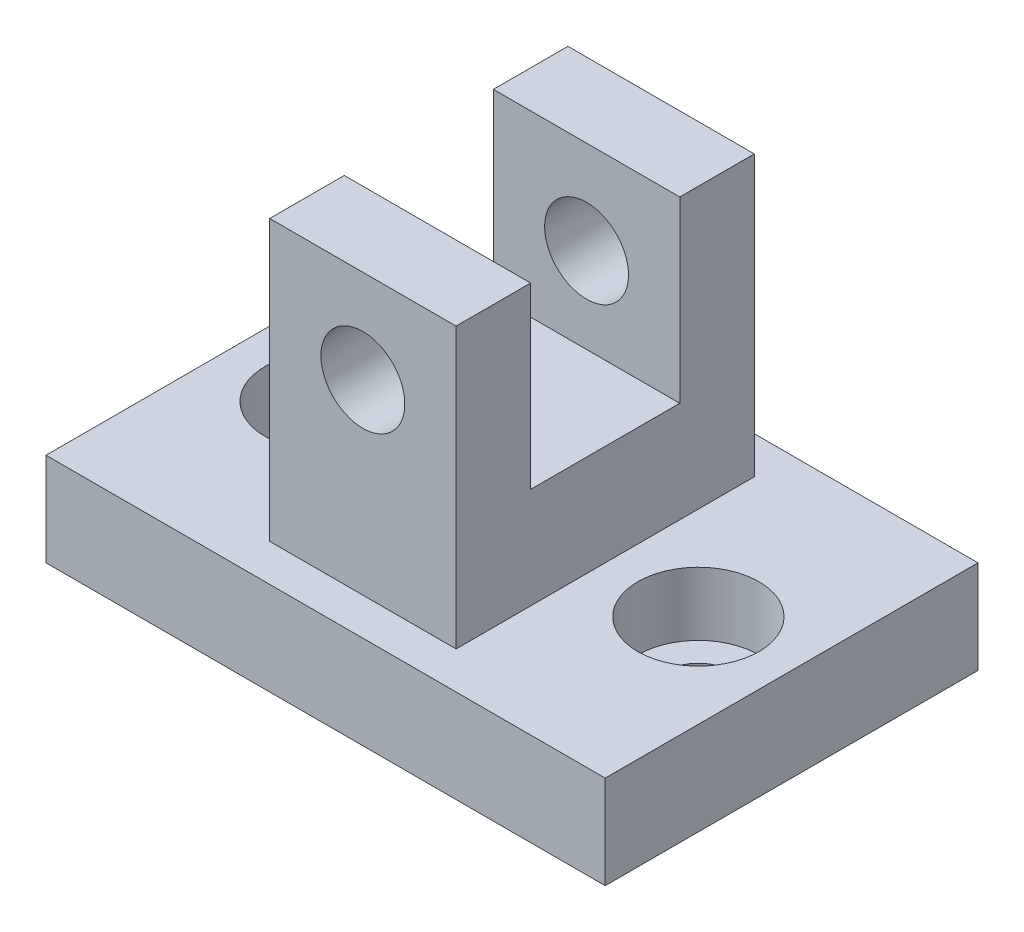
ISO-10303-21;
HEADER;
FILE_DESCRIPTION(('STEP AP214'),'2;1');
FILE_NAME('part.step','',(''),(''),'','','');
FILE_SCHEMA(('AUTOMOTIVE_DESIGN { 1 0 10303 214 1 1 1 1 }'));
ENDSEC;
DATA;
#1=APPLICATION_CONTEXT('core data for automotive mechanical design processes');
#2=APPLICATION_PROTOCOL_DEFINITION('international standard','automotive_design',2000,#1);
#3=PRODUCT_CONTEXT('',#1,'mechanical');
#4=PRODUCT('Part','Part','',(#3));
#5=PRODUCT_RELATED_PRODUCT_CATEGORY('part','',(#4));
#6=PRODUCT_DEFINITION_FORMATION('','',#4);
#7=PRODUCT_DEFINITION_CONTEXT('part definition',#1,'design');
#8=PRODUCT_DEFINITION('design','',#6,#7);
#9=PRODUCT_DEFINITION_SHAPE('','',#8);
#10=(LENGTH_UNIT() NAMED_UNIT(*) SI_UNIT(.MILLI.,.METRE.));
#11=(NAMED_UNIT(*) PLANE_ANGLE_UNIT() SI_UNIT($,.RADIAN.));
#12=(NAMED_UNIT(*) SI_UNIT($,.STERADIAN.) SOLID_ANGLE_UNIT());
#13=UNCERTAINTY_MEASURE_WITH_UNIT(LENGTH_MEASURE(1.E-05),#10,'distance_accuracy_value','');
#14=(GEOMETRIC_REPRESENTATION_CONTEXT(3) GLOBAL_UNCERTAINTY_ASSIGNED_CONTEXT((#13)) GLOBAL_UNIT_ASSIGNED_CONTEXT((#10,
#11,#12)) REPRESENTATION_CONTEXT('',''));
#15=CARTESIAN_POINT('',(0.,0.,0.));
#16=DIRECTION('',(0.,0.,1.));
#17=DIRECTION('',(1.,0.,0.));
#18=AXIS2_PLACEMENT_3D('',#15,#16,#17);
#19=CARTESIAN_POINT('',(0.,20.,0.));
#20=DIRECTION('',(0.,-1.,0.));
#21=DIRECTION('',(0.,0.,-1.));
#22=AXIS2_PLACEMENT_3D('',#19,#20,#21);
#23=PLANE('',#22);
#24=DIRECTION('',(0.,0.,1.));
#25=VECTOR('',#24,1.);
#26=CARTESIAN_POINT('',(-5.,20.,8.));
#27=LINE('',#26,#25);
#28=CARTESIAN_POINT('',(-5.,20.,-8.));
#29=VERTEX_POINT('',#28);
#30=CARTESIAN_POINT('',(-5.,20.,-4.));
#31=VERTEX_POINT('',#30);
#32=EDGE_CURVE('E164',#29,#31,#27,.T.);
#33=ORIENTED_EDGE('',*,*,#32,.T.);
#34=DIRECTION('',(1.,0.,0.));
#35=VECTOR('',#34,1.);
#36=CARTESIAN_POINT('',(0.,20.,-4.));
#37=LINE('',#36,#35);
#38=CARTESIAN_POINT('',(5.,20.,-4.));
#39=VERTEX_POINT('',#38);
#40=EDGE_CURVE('E11',#31,#39,#37,.T.);
#41=ORIENTED_EDGE('',*,*,#40,.T.);
#42=DIRECTION('',(0.,0.,-1.));
#43=VECTOR('',#42,1.);
#44=CARTESIAN_POINT('',(5.,20.,8.));
#45=LINE('',#44,#43);
#46=CARTESIAN_POINT('',(5.,20.,-8.));
#47=VERTEX_POINT('',#46);
#48=EDGE_CURVE('E161',#39,#47,#45,.T.);
#49=ORIENTED_EDGE('',*,*,#48,.T.);
#50=DIRECTION('',(-1.,0.,0.));
#51=VECTOR('',#50,1.);
#52=CARTESIAN_POINT('',(-5.,20.,-8.));
#53=LINE('',#52,#51);
#54=EDGE_CURVE('E160',#47,#29,#53,.T.);
#55=ORIENTED_EDGE('',*,*,#54,.T.);
#56=EDGE_LOOP('',(#33,#41,#49,#55));
#57=FACE_BOUND('',#56,.T.);
#58=ADVANCED_FACE('F33',(#57),#23,.F.);
#59=CARTESIAN_POINT('',(0.,5.,0.));
#60=DIRECTION('',(0.,-1.,0.));
#61=DIRECTION('',(0.,0.,-1.));
#62=AXIS2_PLACEMENT_3D('',#59,#60,#61);
#63=PLANE('',#62);
#64=CARTESIAN_POINT('',(-10.,5.,0.));
#65=DIRECTION('',(0.,1.,0.));
#66=DIRECTION('',(0.,0.,1.));
#67=AXIS2_PLACEMENT_3D('',#64,#65,#66);
#68=CIRCLE('',#67,3.25);
#69=CARTESIAN_POINT('',(-10.,5.,3.25));
#70=VERTEX_POINT('',#69);
#71=EDGE_CURVE('E419',#70,#70,#68,.T.);
#72=ORIENTED_EDGE('',*,*,#71,.F.);
#73=EDGE_LOOP('',(#72));
#74=FACE_BOUND('',#73,.T.);
#75=CARTESIAN_POINT('',(10.,5.,0.));
#76=DIRECTION('',(0.,1.,0.));
#77=DIRECTION('',(0.,0.,1.));
#78=AXIS2_PLACEMENT_3D('',#75,#76,#77);
#79=CIRCLE('',#78,3.25);
#80=CARTESIAN_POINT('',(10.,5.,3.25));
#81=VERTEX_POINT('',#80);
#82=EDGE_CURVE('E236',#81,#81,#79,.T.);
#83=ORIENTED_EDGE('',*,*,#82,.F.);
#84=EDGE_LOOP('',(#83));
#85=FACE_BOUND('',#84,.T.);
#86=DIRECTION('',(0.,0.,-1.));
#87=VECTOR('',#86,1.);
#88=CARTESIAN_POINT('',(15.,5.,10.));
#89=LINE('',#88,#87);
#90=CARTESIAN_POINT('',(15.,5.,10.));
#91=VERTEX_POINT('',#90);
#92=CARTESIAN_POINT('',(15.,5.,-10.));
#93=VERTEX_POINT('',#92);
#94=EDGE_CURVE('E190',#91,#93,#89,.T.);
#95=ORIENTED_EDGE('',*,*,#94,.T.);
#96=DIRECTION('',(-1.,0.,0.));
#97=VECTOR('',#96,1.);
#98=CARTESIAN_POINT('',(-15.,5.,-10.));
#99=LINE('',#98,#97);
#100=CARTESIAN_POINT('',(-15.,5.,-10.));
#101=VERTEX_POINT('',#100);
#102=EDGE_CURVE('E193',#93,#101,#99,.T.);
#103=ORIENTED_EDGE('',*,*,#102,.T.);
#104=DIRECTION('',(0.,0.,1.));
#105=VECTOR('',#104,1.);
#106=CARTESIAN_POINT('',(-15.,5.,10.));
#107=LINE('',#106,#105);
#108=CARTESIAN_POINT('',(-15.,5.,10.));
#109=VERTEX_POINT('',#108);
#110=EDGE_CURVE('E196',#101,#109,#107,.T.);
#111=ORIENTED_EDGE('',*,*,#110,.T.);
#112=DIRECTION('',(1.,0.,0.));
#113=VECTOR('',#112,1.);
#114=CARTESIAN_POINT('',(-15.,5.,10.));
#115=LINE('',#114,#113);
#116=EDGE_CURVE('E198',#109,#91,#115,.T.);
#117=ORIENTED_EDGE('',*,*,#116,.T.);
#118=EDGE_LOOP('',(#95,#103,#111,#117));
#119=FACE_BOUND('',#118,.T.);
#120=DIRECTION('',(0.,0.,-1.));
#121=VECTOR('',#120,1.);
#122=CARTESIAN_POINT('',(5.,5.,8.));
#123=LINE('',#122,#121);
#124=CARTESIAN_POINT('',(5.,5.,8.));
#125=VERTEX_POINT('',#124);
#126=CARTESIAN_POINT('',(5.,5.,-8.));
#127=VERTEX_POINT('',#126);
#128=EDGE_CURVE('E58',#125,#127,#123,.T.);
#129=ORIENTED_EDGE('',*,*,#128,.F.);
#130=DIRECTION('',(1.,0.,0.));
#131=VECTOR('',#130,1.);
#132=CARTESIAN_POINT('',(-5.,5.,8.));
#133=LINE('',#132,#131);
#134=CARTESIAN_POINT('',(-5.,5.,8.));
#135=VERTEX_POINT('',#134);
#136=EDGE_CURVE('E176',#135,#125,#133,.T.);
#137=ORIENTED_EDGE('',*,*,#136,.F.);
#138=DIRECTION('',(0.,0.,1.));
#139=VECTOR('',#138,1.);
#140=CARTESIAN_POINT('',(-5.,5.,8.));
#141=LINE('',#140,#139);
#142=CARTESIAN_POINT('',(-5.,5.,-8.));
#143=VERTEX_POINT('',#142);
#144=EDGE_CURVE('E173',#143,#135,#141,.T.);
#145=ORIENTED_EDGE('',*,*,#144,.F.);
#146=DIRECTION('',(-1.,0.,0.));
#147=VECTOR('',#146,1.);
#148=CARTESIAN_POINT('',(-5.,5.,-8.));
#149=LINE('',#148,#147);
#150=EDGE_CURVE('E170',#127,#143,#149,.T.);
#151=ORIENTED_EDGE('',*,*,#150,.F.);
#152=EDGE_LOOP('',(#129,#137,#145,#151));
#153=FACE_BOUND('',#152,.T.);
#154=ADVANCED_FACE('F270',(#74,#85,#119,#153),#63,.F.);
#155=CARTESIAN_POINT('',(15.,5.,10.));
#156=DIRECTION('',(-1.,0.,0.));
#157=DIRECTION('',(0.,0.,1.));
#158=AXIS2_PLACEMENT_3D('',#155,#156,#157);
#159=PLANE('',#158);
#160=DIRECTION('',(0.,0.,-1.));
#161=VECTOR('',#160,1.);
#162=CARTESIAN_POINT('',(15.,0.,10.));
#163=LINE('',#162,#161);
#164=CARTESIAN_POINT('',(15.,0.,10.));
#165=VERTEX_POINT('',#164);
#166=CARTESIAN_POINT('',(15.,0.,-10.));
#167=VERTEX_POINT('',#166);
#168=EDGE_CURVE('E189',#165,#167,#163,.T.);
#169=ORIENTED_EDGE('',*,*,#168,.T.);
#170=DIRECTION('',(0.,-1.,0.));
#171=VECTOR('',#170,1.);
#172=CARTESIAN_POINT('',(15.,5.,-10.));
#173=LINE('',#172,#171);
#174=EDGE_CURVE('E216',#93,#167,#173,.T.);
#175=ORIENTED_EDGE('',*,*,#174,.F.);
#176=ORIENTED_EDGE('',*,*,#94,.F.);
#177=DIRECTION('',(0.,-1.,0.));
#178=VECTOR('',#177,1.);
#179=CARTESIAN_POINT('',(15.,5.,10.));
#180=LINE('',#179,#178);
#181=EDGE_CURVE('E200',#91,#165,#180,.T.);
#182=ORIENTED_EDGE('',*,*,#181,.T.);
#183=EDGE_LOOP('',(#169,#175,#176,#182));
#184=FACE_BOUND('',#183,.T.);
#185=ADVANCED_FACE('F35',(#184),#159,.F.);
#186=CARTESIAN_POINT('',(-15.,5.,-10.));
#187=DIRECTION('',(0.,0.,1.));
#188=DIRECTION('',(1.,0.,0.));
#189=AXIS2_PLACEMENT_3D('',#186,#187,#188);
#190=PLANE('',#189);
#191=DIRECTION('',(-1.,0.,0.));
#192=VECTOR('',#191,1.);
#193=CARTESIAN_POINT('',(-15.,0.,-10.));
#194=LINE('',#193,#192);
#195=CARTESIAN_POINT('',(-15.,0.,-10.));
#196=VERTEX_POINT('',#195);
#197=EDGE_CURVE('E203',#167,#196,#194,.T.);
#198=ORIENTED_EDGE('',*,*,#197,.T.);
#199=DIRECTION('',(0.,-1.,0.));
#200=VECTOR('',#199,1.);
#201=CARTESIAN_POINT('',(-15.,5.,-10.));
#202=LINE('',#201,#200);
#203=EDGE_CURVE('E213',#101,#196,#202,.T.);
#204=ORIENTED_EDGE('',*,*,#203,.F.);
#205=ORIENTED_EDGE('',*,*,#102,.F.);
#206=ORIENTED_EDGE('',*,*,#174,.T.);
#207=EDGE_LOOP('',(#198,#204,#205,#206));
#208=FACE_BOUND('',#207,.T.);
#209=ADVANCED_FACE('F321',(#208),#190,.F.);
#210=CARTESIAN_POINT('',(-15.,5.,10.));
#211=DIRECTION('',(1.,0.,0.));
#212=DIRECTION('',(0.,0.,-1.));
#213=AXIS2_PLACEMENT_3D('',#210,#211,#212);
#214=PLANE('',#213);
#215=DIRECTION('',(0.,0.,1.));
#216=VECTOR('',#215,1.);
#217=CARTESIAN_POINT('',(-15.,0.,10.));
#218=LINE('',#217,#216);
#219=CARTESIAN_POINT('',(-15.,0.,10.));
#220=VERTEX_POINT('',#219);
#221=EDGE_CURVE('E205',#196,#220,#218,.T.);
#222=ORIENTED_EDGE('',*,*,#221,.T.);
#223=DIRECTION('',(0.,-1.,0.));
#224=VECTOR('',#223,1.);
#225=CARTESIAN_POINT('',(-15.,5.,10.));
#226=LINE('',#225,#224);
#227=EDGE_CURVE('E210',#109,#220,#226,.T.);
#228=ORIENTED_EDGE('',*,*,#227,.F.);
#229=ORIENTED_EDGE('',*,*,#110,.F.);
#230=ORIENTED_EDGE('',*,*,#203,.T.);
#231=EDGE_LOOP('',(#222,#228,#229,#230));
#232=FACE_BOUND('',#231,.T.);
#233=ADVANCED_FACE('F318',(#232),#214,.F.);
#234=CARTESIAN_POINT('',(-15.,5.,10.));
#235=DIRECTION('',(0.,0.,-1.));
#236=DIRECTION('',(-1.,0.,0.));
#237=AXIS2_PLACEMENT_3D('',#234,#235,#236);
#238=PLANE('',#237);
#239=DIRECTION('',(1.,0.,0.));
#240=VECTOR('',#239,1.);
#241=CARTESIAN_POINT('',(-15.,0.,10.));
#242=LINE('',#241,#240);
#243=EDGE_CURVE('E194',#220,#165,#242,.T.);
#244=ORIENTED_EDGE('',*,*,#243,.T.);
#245=ORIENTED_EDGE('',*,*,#181,.F.);
#246=ORIENTED_EDGE('',*,*,#116,.F.);
#247=ORIENTED_EDGE('',*,*,#227,.T.);
#248=EDGE_LOOP('',(#244,#245,#246,#247));
#249=FACE_BOUND('',#248,.T.);
#250=ADVANCED_FACE('F314',(#249),#238,.F.);
#251=CARTESIAN_POINT('',(0.,0.,0.));
#252=DIRECTION('',(0.,-1.,0.));
#253=DIRECTION('',(0.,0.,-1.));
#254=AXIS2_PLACEMENT_3D('',#251,#252,#253);
#255=PLANE('',#254);
#256=CARTESIAN_POINT('',(-10.,0.,0.));
#257=DIRECTION('',(0.,-1.,0.));
#258=DIRECTION('',(0.,0.,-1.));
#259=AXIS2_PLACEMENT_3D('',#256,#257,#258);
#260=CIRCLE('',#259,1.75);
#261=CARTESIAN_POINT('',(-10.,0.,-1.75));
#262=VERTEX_POINT('',#261);
#263=EDGE_CURVE('E228',#262,#262,#260,.T.);
#264=ORIENTED_EDGE('',*,*,#263,.F.);
#265=EDGE_LOOP('',(#264));
#266=FACE_BOUND('',#265,.T.);
#267=CARTESIAN_POINT('',(10.,0.,0.));
#268=DIRECTION('',(0.,-1.,0.));
#269=DIRECTION('',(0.,0.,-1.));
#270=AXIS2_PLACEMENT_3D('',#267,#268,#269);
#271=CIRCLE('',#270,1.75);
#272=CARTESIAN_POINT('',(10.,0.,-1.75));
#273=VERTEX_POINT('',#272);
#274=EDGE_CURVE('E225',#273,#273,#271,.T.);
#275=ORIENTED_EDGE('',*,*,#274,.F.);
#276=EDGE_LOOP('',(#275));
#277=FACE_BOUND('',#276,.T.);
#278=ORIENTED_EDGE('',*,*,#168,.F.);
#279=ORIENTED_EDGE('',*,*,#243,.F.);
#280=ORIENTED_EDGE('',*,*,#221,.F.);
#281=ORIENTED_EDGE('',*,*,#197,.F.);
#282=EDGE_LOOP('',(#278,#279,#280,#281));
#283=FACE_BOUND('',#282,.T.);
#284=ADVANCED_FACE('F308',(#266,#277,#283),#255,.T.);
#285=CARTESIAN_POINT('',(5.,20.,8.));
#286=DIRECTION('',(-1.,0.,0.));
#287=DIRECTION('',(0.,0.,1.));
#288=AXIS2_PLACEMENT_3D('',#285,#286,#287);
#289=PLANE('',#288);
#290=ORIENTED_EDGE('',*,*,#48,.F.);
#291=DIRECTION('',(0.,-1.,0.));
#292=VECTOR('',#291,1.);
#293=CARTESIAN_POINT('',(5.,20.,-4.));
#294=LINE('',#293,#292);
#295=CARTESIAN_POINT('',(5.,10.4139424280589,-4.));
#296=VERTEX_POINT('',#295);
#297=EDGE_CURVE('E154',#39,#296,#294,.T.);
#298=ORIENTED_EDGE('',*,*,#297,.T.);
#299=DIRECTION('',(0.,0.,1.));
#300=VECTOR('',#299,1.);
#301=CARTESIAN_POINT('',(5.,10.4139424280589,8.));
#302=LINE('',#301,#300);
#303=CARTESIAN_POINT('',(5.,10.4139424280589,4.));
#304=VERTEX_POINT('',#303);
#305=EDGE_CURVE('E131',#296,#304,#302,.T.);
#306=ORIENTED_EDGE('',*,*,#305,.T.);
#307=DIRECTION('',(0.,1.,0.));
#308=VECTOR('',#307,1.);
#309=CARTESIAN_POINT('',(5.,20.,4.));
#310=LINE('',#309,#308);
#311=CARTESIAN_POINT('',(5.,20.,4.));
#312=VERTEX_POINT('',#311);
#313=EDGE_CURVE('E150',#304,#312,#310,.T.);
#314=ORIENTED_EDGE('',*,*,#313,.T.);
#315=CARTESIAN_POINT('',(5.,20.,8.));
#316=VERTEX_POINT('',#315);
#317=EDGE_CURVE('E157',#316,#312,#45,.T.);
#318=ORIENTED_EDGE('',*,*,#317,.F.);
#319=DIRECTION('',(0.,-1.,0.));
#320=VECTOR('',#319,1.);
#321=CARTESIAN_POINT('',(5.,20.,8.));
#322=LINE('',#321,#320);
#323=EDGE_CURVE('E168',#316,#125,#322,.T.);
#324=ORIENTED_EDGE('',*,*,#323,.T.);
#325=ORIENTED_EDGE('',*,*,#128,.T.);
#326=DIRECTION('',(0.,-1.,0.));
#327=VECTOR('',#326,1.);
#328=CARTESIAN_POINT('',(5.,20.,-8.));
#329=LINE('',#328,#327);
#330=EDGE_CURVE('E186',#47,#127,#329,.T.);
#331=ORIENTED_EDGE('',*,*,#330,.F.);
#332=EDGE_LOOP('',(#290,#298,#306,#314,#318,#324,#325,#331));
#333=FACE_BOUND('',#332,.T.);
#334=ADVANCED_FACE('F293',(#333),#289,.F.);
#335=CARTESIAN_POINT('',(-5.,20.,-8.));
#336=DIRECTION('',(0.,0.,1.));
#337=DIRECTION('',(1.,0.,0.));
#338=AXIS2_PLACEMENT_3D('',#335,#336,#337);
#339=PLANE('',#338);
#340=CARTESIAN_POINT('',(0.,15.,-8.));
#341=DIRECTION('',(0.,0.,-1.));
#342=DIRECTION('',(-1.,0.,0.));
#343=AXIS2_PLACEMENT_3D('',#340,#341,#342);
#344=CIRCLE('',#343,2.25);
#345=CARTESIAN_POINT('',(-2.25,15.,-8.));
#346=VERTEX_POINT('',#345);
#347=EDGE_CURVE('E224',#346,#346,#344,.T.);
#348=ORIENTED_EDGE('',*,*,#347,.F.);
#349=EDGE_LOOP('',(#348));
#350=FACE_BOUND('',#349,.T.);
#351=ORIENTED_EDGE('',*,*,#150,.T.);
#352=DIRECTION('',(0.,-1.,0.));
#353=VECTOR('',#352,1.);
#354=CARTESIAN_POINT('',(-5.,20.,-8.));
#355=LINE('',#354,#353);
#356=EDGE_CURVE('E183',#29,#143,#355,.T.);
#357=ORIENTED_EDGE('',*,*,#356,.F.);
#358=ORIENTED_EDGE('',*,*,#54,.F.);
#359=ORIENTED_EDGE('',*,*,#330,.T.);
#360=EDGE_LOOP('',(#351,#357,#358,#359));
#361=FACE_BOUND('',#360,.T.);
#362=ADVANCED_FACE('F299',(#350,#361),#339,.F.);
#363=CARTESIAN_POINT('',(-5.,20.,8.));
#364=DIRECTION('',(1.,0.,0.));
#365=DIRECTION('',(0.,0.,-1.));
#366=AXIS2_PLACEMENT_3D('',#363,#364,#365);
#367=PLANE('',#366);
#368=DIRECTION('',(0.,0.,1.));
#369=VECTOR('',#368,1.);
#370=CARTESIAN_POINT('',(-5.,10.4139424280589,-4.));
#371=LINE('',#370,#369);
#372=CARTESIAN_POINT('',(-5.,10.4139424280589,-4.));
#373=VERTEX_POINT('',#372);
#374=CARTESIAN_POINT('',(-5.,10.4139424280589,4.));
#375=VERTEX_POINT('',#374);
#376=EDGE_CURVE('E129',#373,#375,#371,.T.);
#377=ORIENTED_EDGE('',*,*,#376,.F.);
#378=DIRECTION('',(0.,-1.,0.));
#379=VECTOR('',#378,1.);
#380=CARTESIAN_POINT('',(-5.,20.,-4.));
#381=LINE('',#380,#379);
#382=EDGE_CURVE('E137',#31,#373,#381,.T.);
#383=ORIENTED_EDGE('',*,*,#382,.F.);
#384=ORIENTED_EDGE('',*,*,#32,.F.);
#385=ORIENTED_EDGE('',*,*,#356,.T.);
#386=ORIENTED_EDGE('',*,*,#144,.T.);
#387=DIRECTION('',(0.,-1.,0.));
#388=VECTOR('',#387,1.);
#389=CARTESIAN_POINT('',(-5.,20.,8.));
#390=LINE('',#389,#388);
#391=CARTESIAN_POINT('',(-5.,20.,8.));
#392=VERTEX_POINT('',#391);
#393=EDGE_CURVE('E180',#392,#135,#390,.T.);
#394=ORIENTED_EDGE('',*,*,#393,.F.);
#395=CARTESIAN_POINT('',(-5.,20.,4.));
#396=VERTEX_POINT('',#395);
#397=EDGE_CURVE('E163',#396,#392,#27,.T.);
#398=ORIENTED_EDGE('',*,*,#397,.F.);
#399=DIRECTION('',(0.,1.,0.));
#400=VECTOR('',#399,1.);
#401=CARTESIAN_POINT('',(-5.,20.,4.));
#402=LINE('',#401,#400);
#403=EDGE_CURVE('E50',#375,#396,#402,.T.);
#404=ORIENTED_EDGE('',*,*,#403,.F.);
#405=EDGE_LOOP('',(#377,#383,#384,#385,#386,#394,#398,#404));
#406=FACE_BOUND('',#405,.T.);
#407=ADVANCED_FACE('F144',(#406),#367,.F.);
#408=CARTESIAN_POINT('',(-5.,20.,8.));
#409=DIRECTION('',(0.,0.,-1.));
#410=DIRECTION('',(-1.,0.,0.));
#411=AXIS2_PLACEMENT_3D('',#408,#409,#410);
#412=PLANE('',#411);
#413=CARTESIAN_POINT('',(0.,15.,8.));
#414=DIRECTION('',(0.,0.,-1.));
#415=DIRECTION('',(-1.,0.,0.));
#416=AXIS2_PLACEMENT_3D('',#413,#414,#415);
#417=CIRCLE('',#416,2.25);
#418=CARTESIAN_POINT('',(-2.25,15.,8.));
#419=VERTEX_POINT('',#418);
#420=EDGE_CURVE('E142',#419,#419,#417,.T.);
#421=ORIENTED_EDGE('',*,*,#420,.T.);
#422=EDGE_LOOP('',(#421));
#423=FACE_BOUND('',#422,.T.);
#424=ORIENTED_EDGE('',*,*,#136,.T.);
#425=ORIENTED_EDGE('',*,*,#323,.F.);
#426=DIRECTION('',(1.,0.,0.));
#427=VECTOR('',#426,1.);
#428=CARTESIAN_POINT('',(-5.,20.,8.));
#429=LINE('',#428,#427);
#430=EDGE_CURVE('E166',#392,#316,#429,.T.);
#431=ORIENTED_EDGE('',*,*,#430,.F.);
#432=ORIENTED_EDGE('',*,*,#393,.T.);
#433=EDGE_LOOP('',(#424,#425,#431,#432));
#434=FACE_BOUND('',#433,.T.);
#435=ADVANCED_FACE('F250',(#423,#434),#412,.F.);
#436=ORIENTED_EDGE('',*,*,#317,.T.);
#437=DIRECTION('',(-1.,0.,0.));
#438=VECTOR('',#437,1.);
#439=CARTESIAN_POINT('',(0.,20.,4.));
#440=LINE('',#439,#438);
#441=EDGE_CURVE('E42',#312,#396,#440,.T.);
#442=ORIENTED_EDGE('',*,*,#441,.T.);
#443=ORIENTED_EDGE('',*,*,#397,.T.);
#444=ORIENTED_EDGE('',*,*,#430,.T.);
#445=EDGE_LOOP('',(#436,#442,#443,#444));
#446=FACE_BOUND('',#445,.T.);
#447=ADVANCED_FACE('F273',(#446),#23,.F.);
#448=CARTESIAN_POINT('',(15.,10.4139424280589,-4.));
#449=DIRECTION('',(0.,-1.,0.));
#450=DIRECTION('',(0.,0.,-1.));
#451=AXIS2_PLACEMENT_3D('',#448,#449,#450);
#452=PLANE('',#451);
#453=DIRECTION('',(-1.,0.,0.));
#454=VECTOR('',#453,1.);
#455=CARTESIAN_POINT('',(15.,10.4139424280589,-4.));
#456=LINE('',#455,#454);
#457=EDGE_CURVE('E124',#296,#373,#456,.T.);
#458=ORIENTED_EDGE('',*,*,#457,.T.);
#459=ORIENTED_EDGE('',*,*,#376,.T.);
#460=DIRECTION('',(-1.,0.,0.));
#461=VECTOR('',#460,1.);
#462=CARTESIAN_POINT('',(15.,10.4139424280589,4.));
#463=LINE('',#462,#461);
#464=EDGE_CURVE('E134',#304,#375,#463,.T.);
#465=ORIENTED_EDGE('',*,*,#464,.F.);
#466=ORIENTED_EDGE('',*,*,#305,.F.);
#467=EDGE_LOOP('',(#458,#459,#465,#466));
#468=FACE_BOUND('',#467,.T.);
#469=ADVANCED_FACE('F126',(#468),#452,.F.);
#470=CARTESIAN_POINT('',(15.,20.,-4.));
#471=DIRECTION('',(0.,0.,-1.));
#472=DIRECTION('',(0.,1.,0.));
#473=AXIS2_PLACEMENT_3D('',#470,#471,#472);
#474=PLANE('',#473);
#475=CARTESIAN_POINT('',(0.,15.,-4.));
#476=DIRECTION('',(0.,0.,-1.));
#477=DIRECTION('',(0.,1.,0.));
#478=AXIS2_PLACEMENT_3D('',#475,#476,#477);
#479=CIRCLE('',#478,2.25);
#480=CARTESIAN_POINT('',(0.,17.25,-4.));
#481=VERTEX_POINT('',#480);
#482=EDGE_CURVE('E223',#481,#481,#479,.T.);
#483=ORIENTED_EDGE('',*,*,#482,.T.);
#484=EDGE_LOOP('',(#483));
#485=FACE_BOUND('',#484,.T.);
#486=ORIENTED_EDGE('',*,*,#40,.F.);
#487=ORIENTED_EDGE('',*,*,#382,.T.);
#488=ORIENTED_EDGE('',*,*,#457,.F.);
#489=ORIENTED_EDGE('',*,*,#297,.F.);
#490=EDGE_LOOP('',(#486,#487,#488,#489));
#491=FACE_BOUND('',#490,.T.);
#492=ADVANCED_FACE('F138',(#485,#491),#474,.F.);
#493=CARTESIAN_POINT('',(15.,20.,4.));
#494=DIRECTION('',(0.,0.,1.));
#495=DIRECTION('',(0.,-1.,0.));
#496=AXIS2_PLACEMENT_3D('',#493,#494,#495);
#497=PLANE('',#496);
#498=CARTESIAN_POINT('',(0.,15.,4.));
#499=DIRECTION('',(0.,0.,1.));
#500=DIRECTION('',(0.,-1.,0.));
#501=AXIS2_PLACEMENT_3D('',#498,#499,#500);
#502=CIRCLE('',#501,2.25);
#503=CARTESIAN_POINT('',(0.,12.75,4.));
#504=VERTEX_POINT('',#503);
#505=EDGE_CURVE('E220',#504,#504,#502,.T.);
#506=ORIENTED_EDGE('',*,*,#505,.T.);
#507=EDGE_LOOP('',(#506));
#508=FACE_BOUND('',#507,.T.);
#509=ORIENTED_EDGE('',*,*,#464,.T.);
#510=ORIENTED_EDGE('',*,*,#403,.T.);
#511=ORIENTED_EDGE('',*,*,#441,.F.);
#512=ORIENTED_EDGE('',*,*,#313,.F.);
#513=EDGE_LOOP('',(#509,#510,#511,#512));
#514=FACE_BOUND('',#513,.T.);
#515=ADVANCED_FACE('F256',(#508,#514),#497,.F.);
#516=CARTESIAN_POINT('',(0.,15.,10.));
#517=DIRECTION('',(0.,0.,-1.));
#518=DIRECTION('',(-1.,0.,0.));
#519=AXIS2_PLACEMENT_3D('',#516,#517,#518);
#520=CYLINDRICAL_SURFACE('',#519,2.25);
#521=ORIENTED_EDGE('',*,*,#505,.F.);
#522=EDGE_LOOP('',(#521));
#523=FACE_BOUND('',#522,.T.);
#524=ORIENTED_EDGE('',*,*,#420,.F.);
#525=EDGE_LOOP('',(#524));
#526=FACE_BOUND('',#525,.T.);
#527=ADVANCED_FACE('F253',(#523,#526),#520,.F.);
#528=ORIENTED_EDGE('',*,*,#347,.T.);
#529=EDGE_LOOP('',(#528));
#530=FACE_BOUND('',#529,.T.);
#531=ORIENTED_EDGE('',*,*,#482,.F.);
#532=EDGE_LOOP('',(#531));
#533=FACE_BOUND('',#532,.T.);
#534=ADVANCED_FACE('F255',(#530,#533),#520,.F.);
#535=CARTESIAN_POINT('',(10.,-10.,0.));
#536=DIRECTION('',(0.,1.,0.));
#537=DIRECTION('',(0.,0.,1.));
#538=AXIS2_PLACEMENT_3D('',#535,#536,#537);
#539=CYLINDRICAL_SURFACE('',#538,1.75);
#540=CARTESIAN_POINT('',(10.,1.6,0.));
#541=DIRECTION('',(0.,-1.,0.));
#542=DIRECTION('',(0.,0.,-1.));
#543=AXIS2_PLACEMENT_3D('',#540,#541,#542);
#544=CIRCLE('',#543,1.75);
#545=CARTESIAN_POINT('',(10.,1.6,-1.75));
#546=VERTEX_POINT('',#545);
#547=EDGE_CURVE('E229',#546,#546,#544,.F.);
#548=ORIENTED_EDGE('',*,*,#547,.T.);
#549=EDGE_LOOP('',(#548));
#550=FACE_BOUND('',#549,.T.);
#551=ORIENTED_EDGE('',*,*,#274,.T.);
#552=EDGE_LOOP('',(#551));
#553=FACE_BOUND('',#552,.T.);
#554=ADVANCED_FACE('F263',(#550,#553),#539,.F.);
#555=CARTESIAN_POINT('',(-10.,-10.,0.));
#556=DIRECTION('',(0.,1.,0.));
#557=DIRECTION('',(0.,0.,1.));
#558=AXIS2_PLACEMENT_3D('',#555,#556,#557);
#559=CYLINDRICAL_SURFACE('',#558,1.75);
#560=CARTESIAN_POINT('',(-10.,1.6,0.));
#561=DIRECTION('',(0.,-1.,0.));
#562=DIRECTION('',(0.,0.,-1.));
#563=AXIS2_PLACEMENT_3D('',#560,#561,#562);
#564=CIRCLE('',#563,1.75);
#565=CARTESIAN_POINT('',(-10.,1.6,-1.75));
#566=VERTEX_POINT('',#565);
#567=EDGE_CURVE('E37',#566,#566,#564,.F.);
#568=ORIENTED_EDGE('',*,*,#567,.T.);
#569=EDGE_LOOP('',(#568));
#570=FACE_BOUND('',#569,.T.);
#571=ORIENTED_EDGE('',*,*,#263,.T.);
#572=EDGE_LOOP('',(#571));
#573=FACE_BOUND('',#572,.T.);
#574=ADVANCED_FACE('F361',(#570,#573),#559,.F.);
#575=CARTESIAN_POINT('',(11.7,1.6,0.));
#576=DIRECTION('',(0.,-1.,0.));
#577=DIRECTION('',(0.,0.,-1.));
#578=AXIS2_PLACEMENT_3D('',#575,#576,#577);
#579=PLANE('',#578);
#580=CARTESIAN_POINT('',(10.,1.6,0.));
#581=DIRECTION('',(0.,1.,0.));
#582=DIRECTION('',(0.,0.,1.));
#583=AXIS2_PLACEMENT_3D('',#580,#581,#582);
#584=CIRCLE('',#583,3.25);
#585=CARTESIAN_POINT('',(10.,1.6,3.25));
#586=VERTEX_POINT('',#585);
#587=EDGE_CURVE('E232',#586,#586,#584,.T.);
#588=ORIENTED_EDGE('',*,*,#587,.T.);
#589=EDGE_LOOP('',(#588));
#590=FACE_BOUND('',#589,.T.);
#591=ORIENTED_EDGE('',*,*,#547,.F.);
#592=EDGE_LOOP('',(#591));
#593=FACE_BOUND('',#592,.T.);
#594=ADVANCED_FACE('F370',(#590,#593),#579,.F.);
#595=CARTESIAN_POINT('',(10.,5.,0.));
#596=DIRECTION('',(0.,1.,0.));
#597=DIRECTION('',(0.,0.,1.));
#598=AXIS2_PLACEMENT_3D('',#595,#596,#597);
#599=CYLINDRICAL_SURFACE('',#598,3.25);
#600=ORIENTED_EDGE('',*,*,#587,.F.);
#601=EDGE_LOOP('',(#600));
#602=FACE_BOUND('',#601,.T.);
#603=ORIENTED_EDGE('',*,*,#82,.T.);
#604=EDGE_LOOP('',(#603));
#605=FACE_BOUND('',#604,.T.);
#606=ADVANCED_FACE('F380',(#602,#605),#599,.F.);
#607=CARTESIAN_POINT('',(-8.3,1.6,0.));
#608=DIRECTION('',(0.,-1.,0.));
#609=DIRECTION('',(0.,0.,-1.));
#610=AXIS2_PLACEMENT_3D('',#607,#608,#609);
#611=PLANE('',#610);
#612=CARTESIAN_POINT('',(-10.,1.6,0.));
#613=DIRECTION('',(0.,1.,0.));
#614=DIRECTION('',(0.,0.,1.));
#615=AXIS2_PLACEMENT_3D('',#612,#613,#614);
#616=CIRCLE('',#615,3.25);
#617=CARTESIAN_POINT('',(-10.,1.6,3.25));
#618=VERTEX_POINT('',#617);
#619=EDGE_CURVE('E416',#618,#618,#616,.T.);
#620=ORIENTED_EDGE('',*,*,#619,.T.);
#621=EDGE_LOOP('',(#620));
#622=FACE_BOUND('',#621,.T.);
#623=ORIENTED_EDGE('',*,*,#567,.F.);
#624=EDGE_LOOP('',(#623));
#625=FACE_BOUND('',#624,.T.);
#626=ADVANCED_FACE('F389',(#622,#625),#611,.F.);
#627=CARTESIAN_POINT('',(-10.,5.,0.));
#628=DIRECTION('',(0.,1.,0.));
#629=DIRECTION('',(0.,0.,1.));
#630=AXIS2_PLACEMENT_3D('',#627,#628,#629);
#631=CYLINDRICAL_SURFACE('',#630,3.25);
#632=ORIENTED_EDGE('',*,*,#619,.F.);
#633=EDGE_LOOP('',(#632));
#634=FACE_BOUND('',#633,.T.);
#635=ORIENTED_EDGE('',*,*,#71,.T.);
#636=EDGE_LOOP('',(#635));
#637=FACE_BOUND('',#636,.T.);
#638=ADVANCED_FACE('F399',(#634,#637),#631,.F.);
#639=CLOSED_SHELL('',(#58,#154,#185,#209,#233,#250,#284,#334,#362,#407,#435,#447,#469,#492,#515,
#527,#534,#554,#574,#594,#606,#626,#638));
#640=MANIFOLD_SOLID_BREP('B2',#639);
#641=ADVANCED_BREP_SHAPE_REPRESENTATION('',(#18,#640),#14);
#642=SHAPE_DEFINITION_REPRESENTATION(#9,#641);
ENDSEC;
END-ISO-10303-21;
